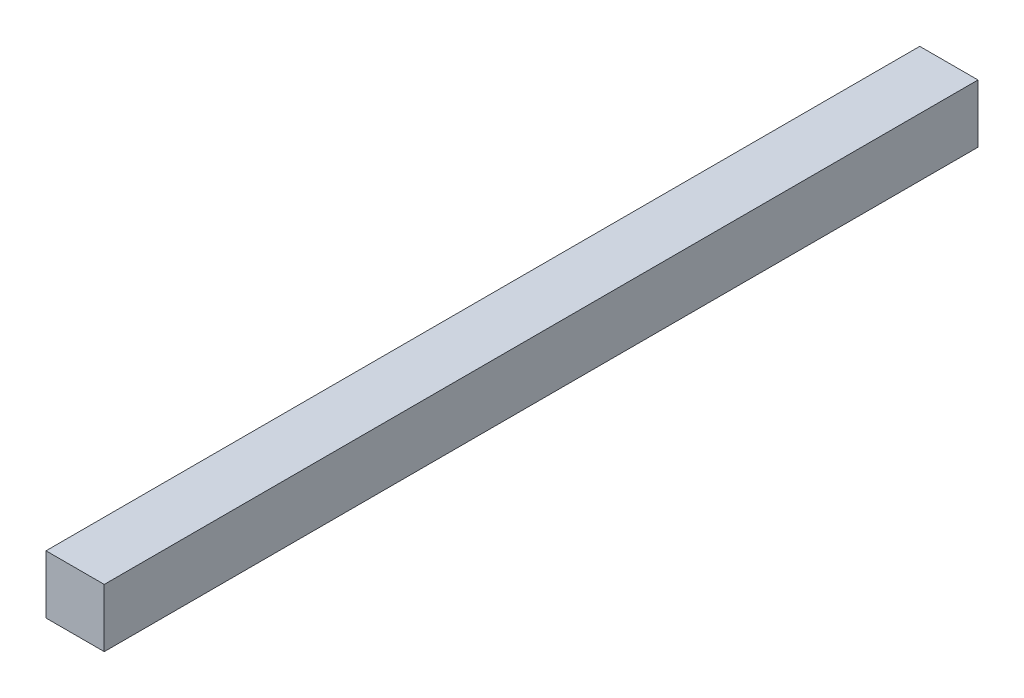
ISO-10303-21;
HEADER;
FILE_DESCRIPTION(('STEP AP214'),'2;1');
FILE_NAME('part.step','',(''),(''),'','','');
FILE_SCHEMA(('AUTOMOTIVE_DESIGN { 1 0 10303 214 1 1 1 1 }'));
ENDSEC;
DATA;
#1=APPLICATION_CONTEXT('core data for automotive mechanical design processes');
#2=APPLICATION_PROTOCOL_DEFINITION('international standard','automotive_design',2000,#1);
#3=PRODUCT_CONTEXT('',#1,'mechanical');
#4=PRODUCT('Part','Part','',(#3));
#5=PRODUCT_RELATED_PRODUCT_CATEGORY('part','',(#4));
#6=PRODUCT_DEFINITION_FORMATION('','',#4);
#7=PRODUCT_DEFINITION_CONTEXT('part definition',#1,'design');
#8=PRODUCT_DEFINITION('design','',#6,#7);
#9=PRODUCT_DEFINITION_SHAPE('','',#8);
#10=(LENGTH_UNIT() NAMED_UNIT(*) SI_UNIT(.MILLI.,.METRE.));
#11=(NAMED_UNIT(*) PLANE_ANGLE_UNIT() SI_UNIT($,.RADIAN.));
#12=(NAMED_UNIT(*) SI_UNIT($,.STERADIAN.) SOLID_ANGLE_UNIT());
#13=UNCERTAINTY_MEASURE_WITH_UNIT(LENGTH_MEASURE(1.E-05),#10,'distance_accuracy_value','');
#14=(GEOMETRIC_REPRESENTATION_CONTEXT(3) GLOBAL_UNCERTAINTY_ASSIGNED_CONTEXT((#13)) GLOBAL_UNIT_ASSIGNED_CONTEXT((#10,
#11,#12)) REPRESENTATION_CONTEXT('',''));
#15=CARTESIAN_POINT('',(0.,0.,0.));
#16=DIRECTION('',(0.,0.,1.));
#17=DIRECTION('',(1.,0.,0.));
#18=AXIS2_PLACEMENT_3D('',#15,#16,#17);
#19=CARTESIAN_POINT('',(-10.,10.,300.));
#20=DIRECTION('',(1.,0.,0.));
#21=DIRECTION('',(0.,1.,0.));
#22=AXIS2_PLACEMENT_3D('',#19,#20,#21);
#23=PLANE('',#22);
#24=DIRECTION('',(0.,-1.,0.));
#25=VECTOR('',#24,1.);
#26=CARTESIAN_POINT('',(-10.,10.,0.));
#27=LINE('',#26,#25);
#28=CARTESIAN_POINT('',(-10.,10.,0.));
#29=VERTEX_POINT('',#28);
#30=CARTESIAN_POINT('',(-10.,-10.,0.));
#31=VERTEX_POINT('',#30);
#32=EDGE_CURVE('E97',#29,#31,#27,.T.);
#33=ORIENTED_EDGE('',*,*,#32,.T.);
#34=DIRECTION('',(0.,0.,-1.));
#35=VECTOR('',#34,1.);
#36=CARTESIAN_POINT('',(-10.,-10.,300.));
#37=LINE('',#36,#35);
#38=CARTESIAN_POINT('',(-10.,-10.,300.));
#39=VERTEX_POINT('',#38);
#40=EDGE_CURVE('E11',#39,#31,#37,.T.);
#41=ORIENTED_EDGE('',*,*,#40,.F.);
#42=DIRECTION('',(0.,-1.,0.));
#43=VECTOR('',#42,1.);
#44=CARTESIAN_POINT('',(-10.,10.,300.));
#45=LINE('',#44,#43);
#46=CARTESIAN_POINT('',(-10.,10.,300.));
#47=VERTEX_POINT('',#46);
#48=EDGE_CURVE('E85',#47,#39,#45,.T.);
#49=ORIENTED_EDGE('',*,*,#48,.F.);
#50=DIRECTION('',(0.,0.,-1.));
#51=VECTOR('',#50,1.);
#52=CARTESIAN_POINT('',(-10.,10.,300.));
#53=LINE('',#52,#51);
#54=EDGE_CURVE('E93',#47,#29,#53,.T.);
#55=ORIENTED_EDGE('',*,*,#54,.T.);
#56=EDGE_LOOP('',(#33,#41,#49,#55));
#57=FACE_BOUND('',#56,.T.);
#58=ADVANCED_FACE('F34',(#57),#23,.F.);
#59=CARTESIAN_POINT('',(-10.,-10.,300.));
#60=DIRECTION('',(0.,1.,0.));
#61=DIRECTION('',(0.,0.,1.));
#62=AXIS2_PLACEMENT_3D('',#59,#60,#61);
#63=PLANE('',#62);
#64=DIRECTION('',(1.,0.,0.));
#65=VECTOR('',#64,1.);
#66=CARTESIAN_POINT('',(-10.,-10.,0.));
#67=LINE('',#66,#65);
#68=CARTESIAN_POINT('',(10.,-10.,0.));
#69=VERTEX_POINT('',#68);
#70=EDGE_CURVE('E89',#31,#69,#67,.T.);
#71=ORIENTED_EDGE('',*,*,#70,.T.);
#72=DIRECTION('',(0.,0.,-1.));
#73=VECTOR('',#72,1.);
#74=CARTESIAN_POINT('',(10.,-10.,300.));
#75=LINE('',#74,#73);
#76=CARTESIAN_POINT('',(10.,-10.,300.));
#77=VERTEX_POINT('',#76);
#78=EDGE_CURVE('E42',#77,#69,#75,.T.);
#79=ORIENTED_EDGE('',*,*,#78,.F.);
#80=DIRECTION('',(1.,0.,0.));
#81=VECTOR('',#80,1.);
#82=CARTESIAN_POINT('',(-10.,-10.,300.));
#83=LINE('',#82,#81);
#84=EDGE_CURVE('E80',#39,#77,#83,.T.);
#85=ORIENTED_EDGE('',*,*,#84,.F.);
#86=ORIENTED_EDGE('',*,*,#40,.T.);
#87=EDGE_LOOP('',(#71,#79,#85,#86));
#88=FACE_BOUND('',#87,.T.);
#89=ADVANCED_FACE('F88',(#88),#63,.F.);
#90=CARTESIAN_POINT('',(10.,10.,300.));
#91=DIRECTION('',(-1.,0.,0.));
#92=DIRECTION('',(0.,0.,1.));
#93=AXIS2_PLACEMENT_3D('',#90,#91,#92);
#94=PLANE('',#93);
#95=DIRECTION('',(0.,1.,0.));
#96=VECTOR('',#95,1.);
#97=CARTESIAN_POINT('',(10.,10.,0.));
#98=LINE('',#97,#96);
#99=CARTESIAN_POINT('',(10.,10.,0.));
#100=VERTEX_POINT('',#99);
#101=EDGE_CURVE('E67',#69,#100,#98,.T.);
#102=ORIENTED_EDGE('',*,*,#101,.T.);
#103=DIRECTION('',(0.,0.,-1.));
#104=VECTOR('',#103,1.);
#105=CARTESIAN_POINT('',(10.,10.,300.));
#106=LINE('',#105,#104);
#107=CARTESIAN_POINT('',(10.,10.,300.));
#108=VERTEX_POINT('',#107);
#109=EDGE_CURVE('E90',#108,#100,#106,.T.);
#110=ORIENTED_EDGE('',*,*,#109,.F.);
#111=DIRECTION('',(0.,1.,0.));
#112=VECTOR('',#111,1.);
#113=CARTESIAN_POINT('',(10.,10.,300.));
#114=LINE('',#113,#112);
#115=EDGE_CURVE('E83',#77,#108,#114,.T.);
#116=ORIENTED_EDGE('',*,*,#115,.F.);
#117=ORIENTED_EDGE('',*,*,#78,.T.);
#118=EDGE_LOOP('',(#102,#110,#116,#117));
#119=FACE_BOUND('',#118,.T.);
#120=ADVANCED_FACE('F91',(#119),#94,.F.);
#121=CARTESIAN_POINT('',(-10.,10.,300.));
#122=DIRECTION('',(0.,-1.,0.));
#123=DIRECTION('',(0.,0.,-1.));
#124=AXIS2_PLACEMENT_3D('',#121,#122,#123);
#125=PLANE('',#124);
#126=DIRECTION('',(-1.,0.,0.));
#127=VECTOR('',#126,1.);
#128=CARTESIAN_POINT('',(-10.,10.,0.));
#129=LINE('',#128,#127);
#130=EDGE_CURVE('E73',#100,#29,#129,.T.);
#131=ORIENTED_EDGE('',*,*,#130,.T.);
#132=ORIENTED_EDGE('',*,*,#54,.F.);
#133=DIRECTION('',(-1.,0.,0.));
#134=VECTOR('',#133,1.);
#135=CARTESIAN_POINT('',(-10.,10.,300.));
#136=LINE('',#135,#134);
#137=EDGE_CURVE('E50',#108,#47,#136,.T.);
#138=ORIENTED_EDGE('',*,*,#137,.F.);
#139=ORIENTED_EDGE('',*,*,#109,.T.);
#140=EDGE_LOOP('',(#131,#132,#138,#139));
#141=FACE_BOUND('',#140,.T.);
#142=ADVANCED_FACE('F104',(#141),#125,.F.);
#143=CARTESIAN_POINT('',(0.,0.,300.));
#144=DIRECTION('',(0.,0.,1.));
#145=DIRECTION('',(1.,0.,0.));
#146=AXIS2_PLACEMENT_3D('',#143,#144,#145);
#147=PLANE('',#146);
#148=ORIENTED_EDGE('',*,*,#48,.T.);
#149=ORIENTED_EDGE('',*,*,#84,.T.);
#150=ORIENTED_EDGE('',*,*,#115,.T.);
#151=ORIENTED_EDGE('',*,*,#137,.T.);
#152=EDGE_LOOP('',(#148,#149,#150,#151));
#153=FACE_BOUND('',#152,.T.);
#154=ADVANCED_FACE('F81',(#153),#147,.T.);
#155=CARTESIAN_POINT('',(0.,0.,0.));
#156=DIRECTION('',(0.,0.,1.));
#157=DIRECTION('',(1.,0.,0.));
#158=AXIS2_PLACEMENT_3D('',#155,#156,#157);
#159=PLANE('',#158);
#160=ORIENTED_EDGE('',*,*,#32,.F.);
#161=ORIENTED_EDGE('',*,*,#130,.F.);
#162=ORIENTED_EDGE('',*,*,#101,.F.);
#163=ORIENTED_EDGE('',*,*,#70,.F.);
#164=EDGE_LOOP('',(#160,#161,#162,#163));
#165=FACE_BOUND('',#164,.T.);
#166=ADVANCED_FACE('F107',(#165),#159,.F.);
#167=CLOSED_SHELL('',(#58,#89,#120,#142,#154,#166));
#168=MANIFOLD_SOLID_BREP('B2',#167);
#169=ADVANCED_BREP_SHAPE_REPRESENTATION('',(#18,#168),#14);
#170=SHAPE_DEFINITION_REPRESENTATION(#9,#169);
ENDSEC;
END-ISO-10303-21;
